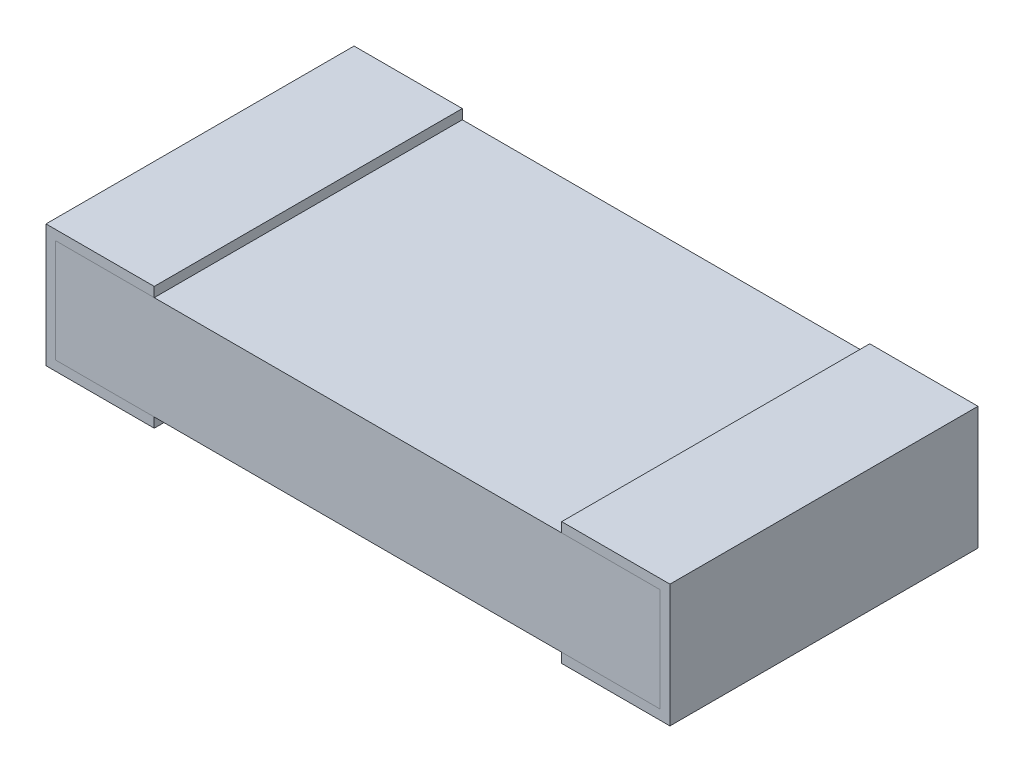
ISO-10303-21;
HEADER;
FILE_DESCRIPTION(('STEP AP214'),'2;1');
FILE_NAME('part.step','',(''),(''),'','','');
FILE_SCHEMA(('AUTOMOTIVE_DESIGN { 1 0 10303 214 1 1 1 1 }'));
ENDSEC;
DATA;
#1=APPLICATION_CONTEXT('core data for automotive mechanical design processes');
#2=APPLICATION_PROTOCOL_DEFINITION('international standard','automotive_design',2000,#1);
#3=PRODUCT_CONTEXT('',#1,'mechanical');
#4=PRODUCT('Part','Part','',(#3));
#5=PRODUCT_RELATED_PRODUCT_CATEGORY('part','',(#4));
#6=PRODUCT_DEFINITION_FORMATION('','',#4);
#7=PRODUCT_DEFINITION_CONTEXT('part definition',#1,'design');
#8=PRODUCT_DEFINITION('design','',#6,#7);
#9=PRODUCT_DEFINITION_SHAPE('','',#8);
#10=(LENGTH_UNIT() NAMED_UNIT(*) SI_UNIT(.MILLI.,.METRE.));
#11=(NAMED_UNIT(*) PLANE_ANGLE_UNIT() SI_UNIT($,.RADIAN.));
#12=(NAMED_UNIT(*) SI_UNIT($,.STERADIAN.) SOLID_ANGLE_UNIT());
#13=UNCERTAINTY_MEASURE_WITH_UNIT(LENGTH_MEASURE(1.E-05),#10,'distance_accuracy_value','');
#14=(GEOMETRIC_REPRESENTATION_CONTEXT(3) GLOBAL_UNCERTAINTY_ASSIGNED_CONTEXT((#13)) GLOBAL_UNIT_ASSIGNED_CONTEXT((#10,
#11,#12)) REPRESENTATION_CONTEXT('',''));
#15=CARTESIAN_POINT('',(0.,0.,0.));
#16=DIRECTION('',(0.,0.,1.));
#17=DIRECTION('',(1.,0.,0.));
#18=AXIS2_PLACEMENT_3D('',#15,#16,#17);
#19=CARTESIAN_POINT('',(0.,0.529999999999998,0.));
#20=DIRECTION('',(0.,-1.,0.));
#21=DIRECTION('',(1.,0.,0.));
#22=AXIS2_PLACEMENT_3D('',#19,#20,#21);
#23=PLANE('',#22);
#24=DIRECTION('',(1.,0.,0.));
#25=VECTOR('',#24,1.);
#26=CARTESIAN_POINT('',(0.,0.529999999999998,1.58));
#27=LINE('',#26,#25);
#28=CARTESIAN_POINT('',(0.,0.529999999999998,1.58));
#29=VERTEX_POINT('',#28);
#30=CARTESIAN_POINT('',(0.505141909197823,0.529999999999998,1.58));
#31=VERTEX_POINT('',#30);
#32=EDGE_CURVE('E145',#29,#31,#27,.T.);
#33=ORIENTED_EDGE('',*,*,#32,.F.);
#34=DIRECTION('',(0.,0.,1.));
#35=VECTOR('',#34,1.);
#36=CARTESIAN_POINT('',(0.,0.529999999999998,0.));
#37=LINE('',#36,#35);
#38=CARTESIAN_POINT('',(0.,0.529999999999998,0.));
#39=VERTEX_POINT('',#38);
#40=EDGE_CURVE('E12',#39,#29,#37,.T.);
#41=ORIENTED_EDGE('',*,*,#40,.F.);
#42=DIRECTION('',(1.,0.,0.));
#43=VECTOR('',#42,1.);
#44=CARTESIAN_POINT('',(0.,0.529999999999998,0.));
#45=LINE('',#44,#43);
#46=CARTESIAN_POINT('',(0.505141909197823,0.529999999999998,0.));
#47=VERTEX_POINT('',#46);
#48=EDGE_CURVE('E165',#39,#47,#45,.T.);
#49=ORIENTED_EDGE('',*,*,#48,.T.);
#50=DIRECTION('',(0.,0.,1.));
#51=VECTOR('',#50,1.);
#52=CARTESIAN_POINT('',(0.505141909197823,0.529999999999998,0.));
#53=LINE('',#52,#51);
#54=EDGE_CURVE('E51',#47,#31,#53,.T.);
#55=ORIENTED_EDGE('',*,*,#54,.T.);
#56=EDGE_LOOP('',(#33,#41,#49,#55));
#57=FACE_BOUND('',#56,.T.);
#58=ADVANCED_FACE('F48',(#57),#23,.T.);
#59=CARTESIAN_POINT('',(0.,0.,0.));
#60=DIRECTION('',(1.,0.,0.));
#61=DIRECTION('',(0.,1.,0.));
#62=AXIS2_PLACEMENT_3D('',#59,#60,#61);
#63=PLANE('',#62);
#64=DIRECTION('',(0.,1.,0.));
#65=VECTOR('',#64,1.);
#66=CARTESIAN_POINT('',(0.,0.,1.58));
#67=LINE('',#66,#65);
#68=CARTESIAN_POINT('',(0.,0.,1.58));
#69=VERTEX_POINT('',#68);
#70=EDGE_CURVE('E163',#69,#29,#67,.T.);
#71=ORIENTED_EDGE('',*,*,#70,.F.);
#72=DIRECTION('',(0.,0.,1.));
#73=VECTOR('',#72,1.);
#74=CARTESIAN_POINT('',(0.,0.,0.));
#75=LINE('',#74,#73);
#76=CARTESIAN_POINT('',(0.,0.,0.));
#77=VERTEX_POINT('',#76);
#78=EDGE_CURVE('E57',#77,#69,#75,.T.);
#79=ORIENTED_EDGE('',*,*,#78,.F.);
#80=DIRECTION('',(0.,1.,0.));
#81=VECTOR('',#80,1.);
#82=CARTESIAN_POINT('',(0.,0.,0.));
#83=LINE('',#82,#81);
#84=EDGE_CURVE('E135',#77,#39,#83,.T.);
#85=ORIENTED_EDGE('',*,*,#84,.T.);
#86=ORIENTED_EDGE('',*,*,#40,.T.);
#87=EDGE_LOOP('',(#71,#79,#85,#86));
#88=FACE_BOUND('',#87,.T.);
#89=ADVANCED_FACE('F177',(#88),#63,.T.);
#90=CARTESIAN_POINT('',(0.505141909197824,0.,0.));
#91=DIRECTION('',(0.,1.,0.));
#92=DIRECTION('',(-1.,0.,0.));
#93=AXIS2_PLACEMENT_3D('',#90,#91,#92);
#94=PLANE('',#93);
#95=DIRECTION('',(-1.,0.,0.));
#96=VECTOR('',#95,1.);
#97=CARTESIAN_POINT('',(0.505141909197824,0.,1.58));
#98=LINE('',#97,#96);
#99=CARTESIAN_POINT('',(0.505141909197824,0.,1.58));
#100=VERTEX_POINT('',#99);
#101=EDGE_CURVE('E122',#100,#69,#98,.T.);
#102=ORIENTED_EDGE('',*,*,#101,.F.);
#103=DIRECTION('',(0.,0.,1.));
#104=VECTOR('',#103,1.);
#105=CARTESIAN_POINT('',(0.505141909197824,0.,0.));
#106=LINE('',#105,#104);
#107=CARTESIAN_POINT('',(0.505141909197824,0.,0.));
#108=VERTEX_POINT('',#107);
#109=EDGE_CURVE('E117',#108,#100,#106,.T.);
#110=ORIENTED_EDGE('',*,*,#109,.F.);
#111=DIRECTION('',(-1.,0.,0.));
#112=VECTOR('',#111,1.);
#113=CARTESIAN_POINT('',(0.505141909197824,0.,0.));
#114=LINE('',#113,#112);
#115=EDGE_CURVE('E120',#108,#77,#114,.T.);
#116=ORIENTED_EDGE('',*,*,#115,.T.);
#117=ORIENTED_EDGE('',*,*,#78,.T.);
#118=EDGE_LOOP('',(#102,#110,#116,#117));
#119=FACE_BOUND('',#118,.T.);
#120=ADVANCED_FACE('F119',(#119),#94,.T.);
#121=CARTESIAN_POINT('',(0.505141909197824,-0.0500000000000016,0.));
#122=DIRECTION('',(1.,0.,0.));
#123=DIRECTION('',(0.,0.,-1.));
#124=AXIS2_PLACEMENT_3D('',#121,#122,#123);
#125=PLANE('',#124);
#126=DIRECTION('',(0.,1.,0.));
#127=VECTOR('',#126,1.);
#128=CARTESIAN_POINT('',(0.505141909197824,-0.0500000000000016,1.58));
#129=LINE('',#128,#127);
#130=CARTESIAN_POINT('',(0.505141909197824,-0.0500000000000016,1.58));
#131=VERTEX_POINT('',#130);
#132=EDGE_CURVE('E160',#131,#100,#129,.T.);
#133=ORIENTED_EDGE('',*,*,#132,.F.);
#134=DIRECTION('',(0.,0.,1.));
#135=VECTOR('',#134,1.);
#136=CARTESIAN_POINT('',(0.505141909197824,-0.0500000000000016,0.));
#137=LINE('',#136,#135);
#138=CARTESIAN_POINT('',(0.505141909197824,-0.0500000000000016,0.));
#139=VERTEX_POINT('',#138);
#140=EDGE_CURVE('E127',#139,#131,#137,.T.);
#141=ORIENTED_EDGE('',*,*,#140,.F.);
#142=DIRECTION('',(0.,1.,0.));
#143=VECTOR('',#142,1.);
#144=CARTESIAN_POINT('',(0.505141909197824,-0.0500000000000016,0.));
#145=LINE('',#144,#143);
#146=EDGE_CURVE('E133',#139,#108,#145,.T.);
#147=ORIENTED_EDGE('',*,*,#146,.T.);
#148=ORIENTED_EDGE('',*,*,#109,.T.);
#149=EDGE_LOOP('',(#133,#141,#147,#148));
#150=FACE_BOUND('',#149,.T.);
#151=ADVANCED_FACE('F137',(#150),#125,.T.);
#152=CARTESIAN_POINT('',(-0.0499999999999997,-0.0500000000000024,0.));
#153=DIRECTION('',(0.,-1.,0.));
#154=DIRECTION('',(1.,0.,0.));
#155=AXIS2_PLACEMENT_3D('',#152,#153,#154);
#156=PLANE('',#155);
#157=DIRECTION('',(1.,0.,0.));
#158=VECTOR('',#157,1.);
#159=CARTESIAN_POINT('',(-0.0499999999999997,-0.0500000000000024,1.58));
#160=LINE('',#159,#158);
#161=CARTESIAN_POINT('',(-0.0499999999999997,-0.0500000000000024,1.58));
#162=VERTEX_POINT('',#161);
#163=EDGE_CURVE('E157',#162,#131,#160,.T.);
#164=ORIENTED_EDGE('',*,*,#163,.F.);
#165=DIRECTION('',(0.,0.,1.));
#166=VECTOR('',#165,1.);
#167=CARTESIAN_POINT('',(-0.0499999999999997,-0.0500000000000024,0.));
#168=LINE('',#167,#166);
#169=CARTESIAN_POINT('',(-0.0499999999999997,-0.0500000000000024,0.));
#170=VERTEX_POINT('',#169);
#171=EDGE_CURVE('E169',#170,#162,#168,.T.);
#172=ORIENTED_EDGE('',*,*,#171,.F.);
#173=DIRECTION('',(1.,0.,0.));
#174=VECTOR('',#173,1.);
#175=CARTESIAN_POINT('',(-0.0499999999999997,-0.0500000000000024,0.));
#176=LINE('',#175,#174);
#177=EDGE_CURVE('E138',#170,#139,#176,.T.);
#178=ORIENTED_EDGE('',*,*,#177,.T.);
#179=ORIENTED_EDGE('',*,*,#140,.T.);
#180=EDGE_LOOP('',(#164,#172,#178,#179));
#181=FACE_BOUND('',#180,.T.);
#182=ADVANCED_FACE('F190',(#181),#156,.T.);
#183=CARTESIAN_POINT('',(-0.0500000000000006,0.579999999999997,0.));
#184=DIRECTION('',(-1.,0.,0.));
#185=DIRECTION('',(0.,-1.,0.));
#186=AXIS2_PLACEMENT_3D('',#183,#184,#185);
#187=PLANE('',#186);
#188=DIRECTION('',(0.,-1.,0.));
#189=VECTOR('',#188,1.);
#190=CARTESIAN_POINT('',(-0.0500000000000006,0.579999999999997,1.58));
#191=LINE('',#190,#189);
#192=CARTESIAN_POINT('',(-0.0500000000000006,0.579999999999997,1.58));
#193=VERTEX_POINT('',#192);
#194=EDGE_CURVE('E154',#193,#162,#191,.T.);
#195=ORIENTED_EDGE('',*,*,#194,.F.);
#196=DIRECTION('',(0.,0.,1.));
#197=VECTOR('',#196,1.);
#198=CARTESIAN_POINT('',(-0.0500000000000006,0.579999999999997,0.));
#199=LINE('',#198,#197);
#200=CARTESIAN_POINT('',(-0.0500000000000006,0.579999999999997,0.));
#201=VERTEX_POINT('',#200);
#202=EDGE_CURVE('E171',#201,#193,#199,.T.);
#203=ORIENTED_EDGE('',*,*,#202,.F.);
#204=DIRECTION('',(0.,-1.,0.));
#205=VECTOR('',#204,1.);
#206=CARTESIAN_POINT('',(-0.0500000000000006,0.579999999999997,0.));
#207=LINE('',#206,#205);
#208=EDGE_CURVE('E140',#201,#170,#207,.T.);
#209=ORIENTED_EDGE('',*,*,#208,.T.);
#210=ORIENTED_EDGE('',*,*,#171,.T.);
#211=EDGE_LOOP('',(#195,#203,#209,#210));
#212=FACE_BOUND('',#211,.T.);
#213=ADVANCED_FACE('F193',(#212),#187,.T.);
#214=CARTESIAN_POINT('',(0.505141909197823,0.579999999999998,0.));
#215=DIRECTION('',(0.,1.,0.));
#216=DIRECTION('',(-1.,0.,0.));
#217=AXIS2_PLACEMENT_3D('',#214,#215,#216);
#218=PLANE('',#217);
#219=DIRECTION('',(-1.,0.,0.));
#220=VECTOR('',#219,1.);
#221=CARTESIAN_POINT('',(0.505141909197823,0.579999999999998,1.58));
#222=LINE('',#221,#220);
#223=CARTESIAN_POINT('',(0.505141909197823,0.579999999999998,1.58));
#224=VERTEX_POINT('',#223);
#225=EDGE_CURVE('E151',#224,#193,#222,.T.);
#226=ORIENTED_EDGE('',*,*,#225,.F.);
#227=DIRECTION('',(0.,0.,1.));
#228=VECTOR('',#227,1.);
#229=CARTESIAN_POINT('',(0.505141909197823,0.579999999999998,0.));
#230=LINE('',#229,#228);
#231=CARTESIAN_POINT('',(0.505141909197823,0.579999999999998,0.));
#232=VERTEX_POINT('',#231);
#233=EDGE_CURVE('E172',#232,#224,#230,.T.);
#234=ORIENTED_EDGE('',*,*,#233,.F.);
#235=DIRECTION('',(-1.,0.,0.));
#236=VECTOR('',#235,1.);
#237=CARTESIAN_POINT('',(0.505141909197823,0.579999999999998,0.));
#238=LINE('',#237,#236);
#239=EDGE_CURVE('E268',#232,#201,#238,.T.);
#240=ORIENTED_EDGE('',*,*,#239,.T.);
#241=ORIENTED_EDGE('',*,*,#202,.T.);
#242=EDGE_LOOP('',(#226,#234,#240,#241));
#243=FACE_BOUND('',#242,.T.);
#244=ADVANCED_FACE('F197',(#243),#218,.T.);
#245=CARTESIAN_POINT('',(0.505141909197823,0.529999999999998,0.));
#246=DIRECTION('',(1.,0.,0.));
#247=DIRECTION('',(0.,0.,-1.));
#248=AXIS2_PLACEMENT_3D('',#245,#246,#247);
#249=PLANE('',#248);
#250=DIRECTION('',(0.,1.,0.));
#251=VECTOR('',#250,1.);
#252=CARTESIAN_POINT('',(0.505141909197823,0.529999999999998,1.58));
#253=LINE('',#252,#251);
#254=EDGE_CURVE('E148',#31,#224,#253,.T.);
#255=ORIENTED_EDGE('',*,*,#254,.F.);
#256=ORIENTED_EDGE('',*,*,#54,.F.);
#257=DIRECTION('',(0.,1.,0.));
#258=VECTOR('',#257,1.);
#259=CARTESIAN_POINT('',(0.505141909197823,0.529999999999998,0.));
#260=LINE('',#259,#258);
#261=EDGE_CURVE('E269',#47,#232,#260,.T.);
#262=ORIENTED_EDGE('',*,*,#261,.T.);
#263=ORIENTED_EDGE('',*,*,#233,.T.);
#264=EDGE_LOOP('',(#255,#256,#262,#263));
#265=FACE_BOUND('',#264,.T.);
#266=ADVANCED_FACE('F174',(#265),#249,.T.);
#267=CARTESIAN_POINT('',(0.,0.,0.));
#268=DIRECTION('',(0.,0.,1.));
#269=DIRECTION('',(1.,0.,0.));
#270=AXIS2_PLACEMENT_3D('',#267,#268,#269);
#271=PLANE('',#270);
#272=ORIENTED_EDGE('',*,*,#48,.F.);
#273=ORIENTED_EDGE('',*,*,#84,.F.);
#274=ORIENTED_EDGE('',*,*,#115,.F.);
#275=ORIENTED_EDGE('',*,*,#146,.F.);
#276=ORIENTED_EDGE('',*,*,#177,.F.);
#277=ORIENTED_EDGE('',*,*,#208,.F.);
#278=ORIENTED_EDGE('',*,*,#239,.F.);
#279=ORIENTED_EDGE('',*,*,#261,.F.);
#280=EDGE_LOOP('',(#272,#273,#274,#275,#276,#277,#278,#279));
#281=FACE_BOUND('',#280,.T.);
#282=ADVANCED_FACE('F131',(#281),#271,.F.);
#283=CARTESIAN_POINT('',(0.,0.,1.58));
#284=DIRECTION('',(0.,0.,1.));
#285=DIRECTION('',(1.,0.,0.));
#286=AXIS2_PLACEMENT_3D('',#283,#284,#285);
#287=PLANE('',#286);
#288=ORIENTED_EDGE('',*,*,#32,.T.);
#289=ORIENTED_EDGE('',*,*,#254,.T.);
#290=ORIENTED_EDGE('',*,*,#225,.T.);
#291=ORIENTED_EDGE('',*,*,#194,.T.);
#292=ORIENTED_EDGE('',*,*,#163,.T.);
#293=ORIENTED_EDGE('',*,*,#132,.T.);
#294=ORIENTED_EDGE('',*,*,#101,.T.);
#295=ORIENTED_EDGE('',*,*,#70,.T.);
#296=EDGE_LOOP('',(#288,#289,#290,#291,#292,#293,#294,#295));
#297=FACE_BOUND('',#296,.T.);
#298=ADVANCED_FACE('F176',(#297),#287,.T.);
#299=CLOSED_SHELL('',(#58,#89,#120,#151,#182,#213,#244,#266,#282,#298));
#300=MANIFOLD_SOLID_BREP('B2',#299);
#301=CARTESIAN_POINT('',(2.59485809080218,0.53,0.));
#302=DIRECTION('',(0.,-1.,0.));
#303=DIRECTION('',(0.,0.,-1.));
#304=AXIS2_PLACEMENT_3D('',#301,#302,#303);
#305=PLANE('',#304);
#306=DIRECTION('',(1.,0.,0.));
#307=VECTOR('',#306,1.);
#308=CARTESIAN_POINT('',(2.59485809080218,0.53,1.58));
#309=LINE('',#308,#307);
#310=CARTESIAN_POINT('',(2.59485809080218,0.53,1.58));
#311=VERTEX_POINT('',#310);
#312=CARTESIAN_POINT('',(3.1,0.53,1.58));
#313=VERTEX_POINT('',#312);
#314=EDGE_CURVE('E382',#311,#313,#309,.T.);
#315=ORIENTED_EDGE('',*,*,#314,.F.);
#316=DIRECTION('',(0.,0.,1.));
#317=VECTOR('',#316,1.);
#318=CARTESIAN_POINT('',(2.59485809080218,0.53,0.));
#319=LINE('',#318,#317);
#320=CARTESIAN_POINT('',(2.59485809080218,0.53,0.));
#321=VERTEX_POINT('',#320);
#322=EDGE_CURVE('E46',#321,#311,#319,.T.);
#323=ORIENTED_EDGE('',*,*,#322,.F.);
#324=DIRECTION('',(1.,0.,0.));
#325=VECTOR('',#324,1.);
#326=CARTESIAN_POINT('',(2.59485809080218,0.53,0.));
#327=LINE('',#326,#325);
#328=CARTESIAN_POINT('',(3.1,0.53,0.));
#329=VERTEX_POINT('',#328);
#330=EDGE_CURVE('E402',#321,#329,#327,.T.);
#331=ORIENTED_EDGE('',*,*,#330,.T.);
#332=DIRECTION('',(0.,0.,1.));
#333=VECTOR('',#332,1.);
#334=CARTESIAN_POINT('',(3.1,0.53,0.));
#335=LINE('',#334,#333);
#336=EDGE_CURVE('E288',#329,#313,#335,.T.);
#337=ORIENTED_EDGE('',*,*,#336,.T.);
#338=EDGE_LOOP('',(#315,#323,#331,#337));
#339=FACE_BOUND('',#338,.T.);
#340=ADVANCED_FACE('F285',(#339),#305,.T.);
#341=CARTESIAN_POINT('',(2.59485809080218,0.53,0.));
#342=DIRECTION('',(-1.,0.,0.));
#343=DIRECTION('',(0.,0.,1.));
#344=AXIS2_PLACEMENT_3D('',#341,#342,#343);
#345=PLANE('',#344);
#346=DIRECTION('',(0.,-1.,0.));
#347=VECTOR('',#346,1.);
#348=CARTESIAN_POINT('',(2.59485809080218,0.53,1.58));
#349=LINE('',#348,#347);
#350=CARTESIAN_POINT('',(2.59485809080218,0.58,1.58));
#351=VERTEX_POINT('',#350);
#352=EDGE_CURVE('E400',#351,#311,#349,.T.);
#353=ORIENTED_EDGE('',*,*,#352,.F.);
#354=DIRECTION('',(0.,0.,1.));
#355=VECTOR('',#354,1.);
#356=CARTESIAN_POINT('',(2.59485809080218,0.58,0.));
#357=LINE('',#356,#355);
#358=CARTESIAN_POINT('',(2.59485809080218,0.58,0.));
#359=VERTEX_POINT('',#358);
#360=EDGE_CURVE('E294',#359,#351,#357,.T.);
#361=ORIENTED_EDGE('',*,*,#360,.F.);
#362=DIRECTION('',(0.,-1.,0.));
#363=VECTOR('',#362,1.);
#364=CARTESIAN_POINT('',(2.59485809080218,0.53,0.));
#365=LINE('',#364,#363);
#366=EDGE_CURVE('E372',#359,#321,#365,.T.);
#367=ORIENTED_EDGE('',*,*,#366,.T.);
#368=ORIENTED_EDGE('',*,*,#322,.T.);
#369=EDGE_LOOP('',(#353,#361,#367,#368));
#370=FACE_BOUND('',#369,.T.);
#371=ADVANCED_FACE('F414',(#370),#345,.T.);
#372=CARTESIAN_POINT('',(2.59485809080218,0.58,0.));
#373=DIRECTION('',(0.,1.,0.));
#374=DIRECTION('',(-1.,0.,0.));
#375=AXIS2_PLACEMENT_3D('',#372,#373,#374);
#376=PLANE('',#375);
#377=DIRECTION('',(-1.,0.,0.));
#378=VECTOR('',#377,1.);
#379=CARTESIAN_POINT('',(2.59485809080218,0.58,1.58));
#380=LINE('',#379,#378);
#381=CARTESIAN_POINT('',(3.15,0.58,1.58));
#382=VERTEX_POINT('',#381);
#383=EDGE_CURVE('E359',#382,#351,#380,.T.);
#384=ORIENTED_EDGE('',*,*,#383,.F.);
#385=DIRECTION('',(0.,0.,1.));
#386=VECTOR('',#385,1.);
#387=CARTESIAN_POINT('',(3.15,0.58,0.));
#388=LINE('',#387,#386);
#389=CARTESIAN_POINT('',(3.15,0.58,0.));
#390=VERTEX_POINT('',#389);
#391=EDGE_CURVE('E354',#390,#382,#388,.T.);
#392=ORIENTED_EDGE('',*,*,#391,.F.);
#393=DIRECTION('',(-1.,0.,0.));
#394=VECTOR('',#393,1.);
#395=CARTESIAN_POINT('',(2.59485809080218,0.58,0.));
#396=LINE('',#395,#394);
#397=EDGE_CURVE('E357',#390,#359,#396,.T.);
#398=ORIENTED_EDGE('',*,*,#397,.T.);
#399=ORIENTED_EDGE('',*,*,#360,.T.);
#400=EDGE_LOOP('',(#384,#392,#398,#399));
#401=FACE_BOUND('',#400,.T.);
#402=ADVANCED_FACE('F356',(#401),#376,.T.);
#403=CARTESIAN_POINT('',(3.15,0.58,0.));
#404=DIRECTION('',(1.,0.,0.));
#405=DIRECTION('',(0.,0.,-1.));
#406=AXIS2_PLACEMENT_3D('',#403,#404,#405);
#407=PLANE('',#406);
#408=DIRECTION('',(0.,1.,0.));
#409=VECTOR('',#408,1.);
#410=CARTESIAN_POINT('',(3.15,0.58,1.58));
#411=LINE('',#410,#409);
#412=CARTESIAN_POINT('',(3.15,-0.05,1.58));
#413=VERTEX_POINT('',#412);
#414=EDGE_CURVE('E397',#413,#382,#411,.T.);
#415=ORIENTED_EDGE('',*,*,#414,.F.);
#416=DIRECTION('',(0.,0.,1.));
#417=VECTOR('',#416,1.);
#418=CARTESIAN_POINT('',(3.15,-0.05,0.));
#419=LINE('',#418,#417);
#420=CARTESIAN_POINT('',(3.15,-0.05,0.));
#421=VERTEX_POINT('',#420);
#422=EDGE_CURVE('E364',#421,#413,#419,.T.);
#423=ORIENTED_EDGE('',*,*,#422,.F.);
#424=DIRECTION('',(0.,1.,0.));
#425=VECTOR('',#424,1.);
#426=CARTESIAN_POINT('',(3.15,0.58,0.));
#427=LINE('',#426,#425);
#428=EDGE_CURVE('E370',#421,#390,#427,.T.);
#429=ORIENTED_EDGE('',*,*,#428,.T.);
#430=ORIENTED_EDGE('',*,*,#391,.T.);
#431=EDGE_LOOP('',(#415,#423,#429,#430));
#432=FACE_BOUND('',#431,.T.);
#433=ADVANCED_FACE('F374',(#432),#407,.T.);
#434=CARTESIAN_POINT('',(3.15,-0.05,0.));
#435=DIRECTION('',(0.,-1.,0.));
#436=DIRECTION('',(1.,0.,0.));
#437=AXIS2_PLACEMENT_3D('',#434,#435,#436);
#438=PLANE('',#437);
#439=DIRECTION('',(1.,0.,0.));
#440=VECTOR('',#439,1.);
#441=CARTESIAN_POINT('',(3.15,-0.05,1.58));
#442=LINE('',#441,#440);
#443=CARTESIAN_POINT('',(2.59485809080218,-0.0500000000000001,1.58));
#444=VERTEX_POINT('',#443);
#445=EDGE_CURVE('E394',#444,#413,#442,.T.);
#446=ORIENTED_EDGE('',*,*,#445,.F.);
#447=DIRECTION('',(0.,0.,1.));
#448=VECTOR('',#447,1.);
#449=CARTESIAN_POINT('',(2.59485809080218,-0.0500000000000001,0.));
#450=LINE('',#449,#448);
#451=CARTESIAN_POINT('',(2.59485809080218,-0.0500000000000001,0.));
#452=VERTEX_POINT('',#451);
#453=EDGE_CURVE('E406',#452,#444,#450,.T.);
#454=ORIENTED_EDGE('',*,*,#453,.F.);
#455=DIRECTION('',(1.,0.,0.));
#456=VECTOR('',#455,1.);
#457=CARTESIAN_POINT('',(3.15,-0.05,0.));
#458=LINE('',#457,#456);
#459=EDGE_CURVE('E375',#452,#421,#458,.T.);
#460=ORIENTED_EDGE('',*,*,#459,.T.);
#461=ORIENTED_EDGE('',*,*,#422,.T.);
#462=EDGE_LOOP('',(#446,#454,#460,#461));
#463=FACE_BOUND('',#462,.T.);
#464=ADVANCED_FACE('F427',(#463),#438,.T.);
#465=CARTESIAN_POINT('',(2.59485809080218,-0.0500000000000001,0.));
#466=DIRECTION('',(-1.,0.,0.));
#467=DIRECTION('',(0.,0.,1.));
#468=AXIS2_PLACEMENT_3D('',#465,#466,#467);
#469=PLANE('',#468);
#470=DIRECTION('',(0.,-1.,0.));
#471=VECTOR('',#470,1.);
#472=CARTESIAN_POINT('',(2.59485809080218,-0.0500000000000001,1.58));
#473=LINE('',#472,#471);
#474=CARTESIAN_POINT('',(2.59485809080218,0.,1.58));
#475=VERTEX_POINT('',#474);
#476=EDGE_CURVE('E391',#475,#444,#473,.T.);
#477=ORIENTED_EDGE('',*,*,#476,.F.);
#478=DIRECTION('',(0.,0.,1.));
#479=VECTOR('',#478,1.);
#480=CARTESIAN_POINT('',(2.59485809080218,0.,0.));
#481=LINE('',#480,#479);
#482=CARTESIAN_POINT('',(2.59485809080218,0.,0.));
#483=VERTEX_POINT('',#482);
#484=EDGE_CURVE('E408',#483,#475,#481,.T.);
#485=ORIENTED_EDGE('',*,*,#484,.F.);
#486=DIRECTION('',(0.,-1.,0.));
#487=VECTOR('',#486,1.);
#488=CARTESIAN_POINT('',(2.59485809080218,-0.0500000000000001,0.));
#489=LINE('',#488,#487);
#490=EDGE_CURVE('E377',#483,#452,#489,.T.);
#491=ORIENTED_EDGE('',*,*,#490,.T.);
#492=ORIENTED_EDGE('',*,*,#453,.T.);
#493=EDGE_LOOP('',(#477,#485,#491,#492));
#494=FACE_BOUND('',#493,.T.);
#495=ADVANCED_FACE('F430',(#494),#469,.T.);
#496=CARTESIAN_POINT('',(2.59485809080218,0.,0.));
#497=DIRECTION('',(0.,1.,0.));
#498=DIRECTION('',(0.,0.,1.));
#499=AXIS2_PLACEMENT_3D('',#496,#497,#498);
#500=PLANE('',#499);
#501=DIRECTION('',(-1.,0.,0.));
#502=VECTOR('',#501,1.);
#503=CARTESIAN_POINT('',(2.59485809080218,0.,1.58));
#504=LINE('',#503,#502);
#505=CARTESIAN_POINT('',(3.1,0.,1.58));
#506=VERTEX_POINT('',#505);
#507=EDGE_CURVE('E388',#506,#475,#504,.T.);
#508=ORIENTED_EDGE('',*,*,#507,.F.);
#509=DIRECTION('',(0.,0.,1.));
#510=VECTOR('',#509,1.);
#511=CARTESIAN_POINT('',(3.1,0.,0.));
#512=LINE('',#511,#510);
#513=CARTESIAN_POINT('',(3.1,0.,0.));
#514=VERTEX_POINT('',#513);
#515=EDGE_CURVE('E409',#514,#506,#512,.T.);
#516=ORIENTED_EDGE('',*,*,#515,.F.);
#517=DIRECTION('',(-1.,0.,0.));
#518=VECTOR('',#517,1.);
#519=CARTESIAN_POINT('',(2.59485809080218,0.,0.));
#520=LINE('',#519,#518);
#521=EDGE_CURVE('E505',#514,#483,#520,.T.);
#522=ORIENTED_EDGE('',*,*,#521,.T.);
#523=ORIENTED_EDGE('',*,*,#484,.T.);
#524=EDGE_LOOP('',(#508,#516,#522,#523));
#525=FACE_BOUND('',#524,.T.);
#526=ADVANCED_FACE('F434',(#525),#500,.T.);
#527=CARTESIAN_POINT('',(3.1,0.,0.));
#528=DIRECTION('',(-1.,0.,0.));
#529=DIRECTION('',(0.,-1.,0.));
#530=AXIS2_PLACEMENT_3D('',#527,#528,#529);
#531=PLANE('',#530);
#532=DIRECTION('',(0.,-1.,0.));
#533=VECTOR('',#532,1.);
#534=CARTESIAN_POINT('',(3.1,0.,1.58));
#535=LINE('',#534,#533);
#536=EDGE_CURVE('E385',#313,#506,#535,.T.);
#537=ORIENTED_EDGE('',*,*,#536,.F.);
#538=ORIENTED_EDGE('',*,*,#336,.F.);
#539=DIRECTION('',(0.,-1.,0.));
#540=VECTOR('',#539,1.);
#541=CARTESIAN_POINT('',(3.1,0.,0.));
#542=LINE('',#541,#540);
#543=EDGE_CURVE('E506',#329,#514,#542,.T.);
#544=ORIENTED_EDGE('',*,*,#543,.T.);
#545=ORIENTED_EDGE('',*,*,#515,.T.);
#546=EDGE_LOOP('',(#537,#538,#544,#545));
#547=FACE_BOUND('',#546,.T.);
#548=ADVANCED_FACE('F411',(#547),#531,.T.);
#549=CARTESIAN_POINT('',(0.,0.,0.));
#550=DIRECTION('',(0.,0.,1.));
#551=DIRECTION('',(1.,0.,0.));
#552=AXIS2_PLACEMENT_3D('',#549,#550,#551);
#553=PLANE('',#552);
#554=ORIENTED_EDGE('',*,*,#330,.F.);
#555=ORIENTED_EDGE('',*,*,#366,.F.);
#556=ORIENTED_EDGE('',*,*,#397,.F.);
#557=ORIENTED_EDGE('',*,*,#428,.F.);
#558=ORIENTED_EDGE('',*,*,#459,.F.);
#559=ORIENTED_EDGE('',*,*,#490,.F.);
#560=ORIENTED_EDGE('',*,*,#521,.F.);
#561=ORIENTED_EDGE('',*,*,#543,.F.);
#562=EDGE_LOOP('',(#554,#555,#556,#557,#558,#559,#560,#561));
#563=FACE_BOUND('',#562,.T.);
#564=ADVANCED_FACE('F368',(#563),#553,.F.);
#565=CARTESIAN_POINT('',(0.,0.,1.58));
#566=DIRECTION('',(0.,0.,1.));
#567=DIRECTION('',(1.,0.,0.));
#568=AXIS2_PLACEMENT_3D('',#565,#566,#567);
#569=PLANE('',#568);
#570=ORIENTED_EDGE('',*,*,#314,.T.);
#571=ORIENTED_EDGE('',*,*,#536,.T.);
#572=ORIENTED_EDGE('',*,*,#507,.T.);
#573=ORIENTED_EDGE('',*,*,#476,.T.);
#574=ORIENTED_EDGE('',*,*,#445,.T.);
#575=ORIENTED_EDGE('',*,*,#414,.T.);
#576=ORIENTED_EDGE('',*,*,#383,.T.);
#577=ORIENTED_EDGE('',*,*,#352,.T.);
#578=EDGE_LOOP('',(#570,#571,#572,#573,#574,#575,#576,#577));
#579=FACE_BOUND('',#578,.T.);
#580=ADVANCED_FACE('F413',(#579),#569,.T.);
#581=CLOSED_SHELL('',(#340,#371,#402,#433,#464,#495,#526,#548,#564,#580));
#582=MANIFOLD_SOLID_BREP('B6',#581);
#583=CARTESIAN_POINT('',(0.,0.,1.58));
#584=DIRECTION('',(1.,0.,0.));
#585=DIRECTION('',(0.,0.,-1.));
#586=AXIS2_PLACEMENT_3D('',#583,#584,#585);
#587=PLANE('',#586);
#588=DIRECTION('',(0.,-1.,0.));
#589=VECTOR('',#588,1.);
#590=CARTESIAN_POINT('',(0.,0.,0.));
#591=LINE('',#590,#589);
#592=CARTESIAN_POINT('',(0.,0.53,0.));
#593=VERTEX_POINT('',#592);
#594=CARTESIAN_POINT('',(0.,0.,0.));
#595=VERTEX_POINT('',#594);
#596=EDGE_CURVE('E576',#593,#595,#591,.T.);
#597=ORIENTED_EDGE('',*,*,#596,.T.);
#598=DIRECTION('',(0.,0.,-1.));
#599=VECTOR('',#598,1.);
#600=CARTESIAN_POINT('',(0.,0.,1.58));
#601=LINE('',#600,#599);
#602=CARTESIAN_POINT('',(0.,0.,1.58));
#603=VERTEX_POINT('',#602);
#604=EDGE_CURVE('E283',#603,#595,#601,.T.);
#605=ORIENTED_EDGE('',*,*,#604,.F.);
#606=DIRECTION('',(0.,-1.,0.));
#607=VECTOR('',#606,1.);
#608=CARTESIAN_POINT('',(0.,0.,1.58));
#609=LINE('',#608,#607);
#610=CARTESIAN_POINT('',(0.,0.53,1.58));
#611=VERTEX_POINT('',#610);
#612=EDGE_CURVE('E564',#611,#603,#609,.T.);
#613=ORIENTED_EDGE('',*,*,#612,.F.);
#614=DIRECTION('',(0.,0.,-1.));
#615=VECTOR('',#614,1.);
#616=CARTESIAN_POINT('',(0.,0.53,1.58));
#617=LINE('',#616,#615);
#618=EDGE_CURVE('E572',#611,#593,#617,.T.);
#619=ORIENTED_EDGE('',*,*,#618,.T.);
#620=EDGE_LOOP('',(#597,#605,#613,#619));
#621=FACE_BOUND('',#620,.T.);
#622=ADVANCED_FACE('F513',(#621),#587,.F.);
#623=CARTESIAN_POINT('',(0.,0.,1.58));
#624=DIRECTION('',(0.,1.,0.));
#625=DIRECTION('',(0.,0.,1.));
#626=AXIS2_PLACEMENT_3D('',#623,#624,#625);
#627=PLANE('',#626);
#628=DIRECTION('',(1.,0.,0.));
#629=VECTOR('',#628,1.);
#630=CARTESIAN_POINT('',(0.,0.,0.));
#631=LINE('',#630,#629);
#632=CARTESIAN_POINT('',(3.1,0.,0.));
#633=VERTEX_POINT('',#632);
#634=EDGE_CURVE('E568',#595,#633,#631,.T.);
#635=ORIENTED_EDGE('',*,*,#634,.T.);
#636=DIRECTION('',(0.,0.,-1.));
#637=VECTOR('',#636,1.);
#638=CARTESIAN_POINT('',(3.1,0.,1.58));
#639=LINE('',#638,#637);
#640=CARTESIAN_POINT('',(3.1,0.,1.58));
#641=VERTEX_POINT('',#640);
#642=EDGE_CURVE('E521',#641,#633,#639,.T.);
#643=ORIENTED_EDGE('',*,*,#642,.F.);
#644=DIRECTION('',(1.,0.,0.));
#645=VECTOR('',#644,1.);
#646=CARTESIAN_POINT('',(0.,0.,1.58));
#647=LINE('',#646,#645);
#648=EDGE_CURVE('E559',#603,#641,#647,.T.);
#649=ORIENTED_EDGE('',*,*,#648,.F.);
#650=ORIENTED_EDGE('',*,*,#604,.T.);
#651=EDGE_LOOP('',(#635,#643,#649,#650));
#652=FACE_BOUND('',#651,.T.);
#653=ADVANCED_FACE('F567',(#652),#627,.F.);
#654=CARTESIAN_POINT('',(3.1,0.,1.58));
#655=DIRECTION('',(-1.,0.,0.));
#656=DIRECTION('',(0.,-1.,0.));
#657=AXIS2_PLACEMENT_3D('',#654,#655,#656);
#658=PLANE('',#657);
#659=DIRECTION('',(0.,1.,0.));
#660=VECTOR('',#659,1.);
#661=CARTESIAN_POINT('',(3.1,0.,0.));
#662=LINE('',#661,#660);
#663=CARTESIAN_POINT('',(3.1,0.53,0.));
#664=VERTEX_POINT('',#663);
#665=EDGE_CURVE('E546',#633,#664,#662,.T.);
#666=ORIENTED_EDGE('',*,*,#665,.T.);
#667=DIRECTION('',(0.,0.,-1.));
#668=VECTOR('',#667,1.);
#669=CARTESIAN_POINT('',(3.1,0.53,1.58));
#670=LINE('',#669,#668);
#671=CARTESIAN_POINT('',(3.1,0.53,1.58));
#672=VERTEX_POINT('',#671);
#673=EDGE_CURVE('E569',#672,#664,#670,.T.);
#674=ORIENTED_EDGE('',*,*,#673,.F.);
#675=DIRECTION('',(0.,1.,0.));
#676=VECTOR('',#675,1.);
#677=CARTESIAN_POINT('',(3.1,0.,1.58));
#678=LINE('',#677,#676);
#679=EDGE_CURVE('E562',#641,#672,#678,.T.);
#680=ORIENTED_EDGE('',*,*,#679,.F.);
#681=ORIENTED_EDGE('',*,*,#642,.T.);
#682=EDGE_LOOP('',(#666,#674,#680,#681));
#683=FACE_BOUND('',#682,.T.);
#684=ADVANCED_FACE('F570',(#683),#658,.F.);
#685=CARTESIAN_POINT('',(0.,0.53,1.58));
#686=DIRECTION('',(0.,-1.,0.));
#687=DIRECTION('',(1.,0.,0.));
#688=AXIS2_PLACEMENT_3D('',#685,#686,#687);
#689=PLANE('',#688);
#690=DIRECTION('',(-1.,0.,0.));
#691=VECTOR('',#690,1.);
#692=CARTESIAN_POINT('',(0.,0.53,0.));
#693=LINE('',#692,#691);
#694=EDGE_CURVE('E552',#664,#593,#693,.T.);
#695=ORIENTED_EDGE('',*,*,#694,.T.);
#696=ORIENTED_EDGE('',*,*,#618,.F.);
#697=DIRECTION('',(-1.,0.,0.));
#698=VECTOR('',#697,1.);
#699=CARTESIAN_POINT('',(0.,0.53,1.58));
#700=LINE('',#699,#698);
#701=EDGE_CURVE('E529',#672,#611,#700,.T.);
#702=ORIENTED_EDGE('',*,*,#701,.F.);
#703=ORIENTED_EDGE('',*,*,#673,.T.);
#704=EDGE_LOOP('',(#695,#696,#702,#703));
#705=FACE_BOUND('',#704,.T.);
#706=ADVANCED_FACE('F583',(#705),#689,.F.);
#707=CARTESIAN_POINT('',(0.,0.,1.58));
#708=DIRECTION('',(0.,0.,-1.));
#709=DIRECTION('',(-1.,0.,0.));
#710=AXIS2_PLACEMENT_3D('',#707,#708,#709);
#711=PLANE('',#710);
#712=ORIENTED_EDGE('',*,*,#612,.T.);
#713=ORIENTED_EDGE('',*,*,#648,.T.);
#714=ORIENTED_EDGE('',*,*,#679,.T.);
#715=ORIENTED_EDGE('',*,*,#701,.T.);
#716=EDGE_LOOP('',(#712,#713,#714,#715));
#717=FACE_BOUND('',#716,.T.);
#718=ADVANCED_FACE('F560',(#717),#711,.F.);
#719=CARTESIAN_POINT('',(0.,0.,0.));
#720=DIRECTION('',(0.,0.,-1.));
#721=DIRECTION('',(-1.,0.,0.));
#722=AXIS2_PLACEMENT_3D('',#719,#720,#721);
#723=PLANE('',#722);
#724=ORIENTED_EDGE('',*,*,#596,.F.);
#725=ORIENTED_EDGE('',*,*,#694,.F.);
#726=ORIENTED_EDGE('',*,*,#665,.F.);
#727=ORIENTED_EDGE('',*,*,#634,.F.);
#728=EDGE_LOOP('',(#724,#725,#726,#727));
#729=FACE_BOUND('',#728,.T.);
#730=ADVANCED_FACE('F586',(#729),#723,.T.);
#731=CLOSED_SHELL('',(#622,#653,#684,#706,#718,#730));
#732=MANIFOLD_SOLID_BREP('B40',#731);
#733=ADVANCED_BREP_SHAPE_REPRESENTATION('',(#18,#300,#582,#732),#14);
#734=SHAPE_DEFINITION_REPRESENTATION(#9,#733);
ENDSEC;
END-ISO-10303-21;
